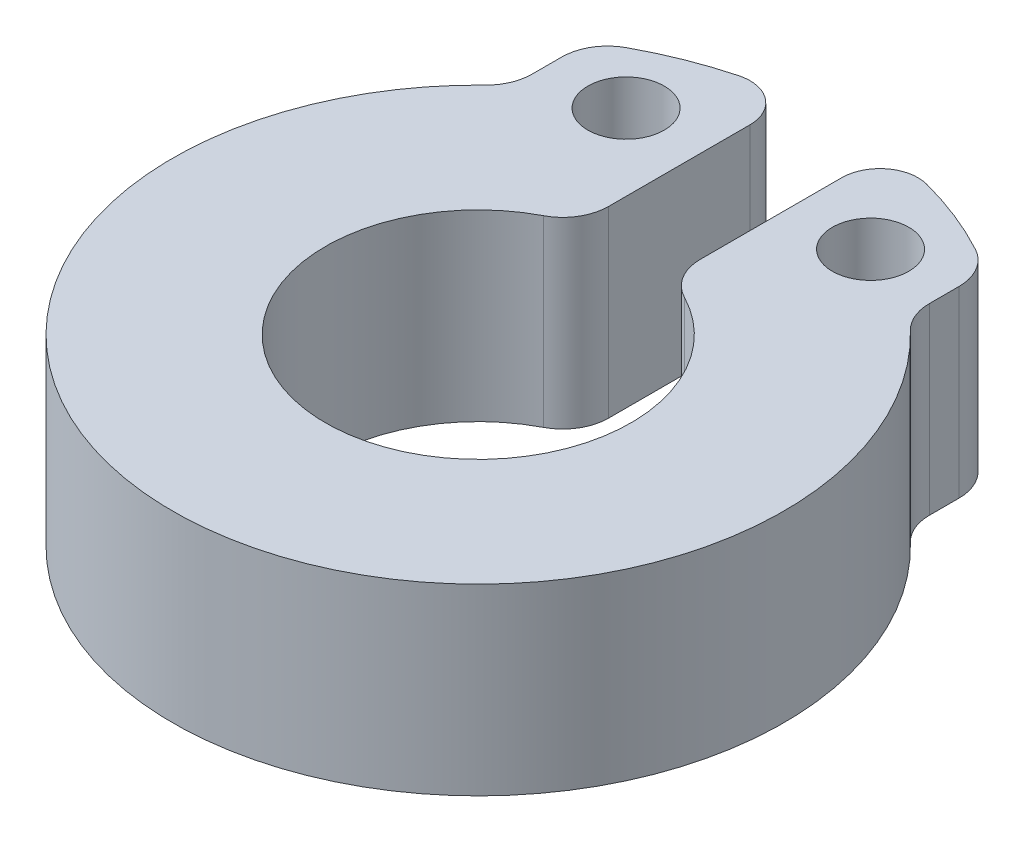
ISO-10303-21;
HEADER;
FILE_DESCRIPTION(('STEP AP214'),'2;1');
FILE_NAME('part.step','',(''),(''),'','','');
FILE_SCHEMA(('AUTOMOTIVE_DESIGN { 1 0 10303 214 1 1 1 1 }'));
ENDSEC;
DATA;
#1=APPLICATION_CONTEXT('core data for automotive mechanical design processes');
#2=APPLICATION_PROTOCOL_DEFINITION('international standard','automotive_design',2000,#1);
#3=PRODUCT_CONTEXT('',#1,'mechanical');
#4=PRODUCT('Part','Part','',(#3));
#5=PRODUCT_RELATED_PRODUCT_CATEGORY('part','',(#4));
#6=PRODUCT_DEFINITION_FORMATION('','',#4);
#7=PRODUCT_DEFINITION_CONTEXT('part definition',#1,'design');
#8=PRODUCT_DEFINITION('design','',#6,#7);
#9=PRODUCT_DEFINITION_SHAPE('','',#8);
#10=(LENGTH_UNIT() NAMED_UNIT(*) SI_UNIT(.MILLI.,.METRE.));
#11=(NAMED_UNIT(*) PLANE_ANGLE_UNIT() SI_UNIT($,.RADIAN.));
#12=(NAMED_UNIT(*) SI_UNIT($,.STERADIAN.) SOLID_ANGLE_UNIT());
#13=UNCERTAINTY_MEASURE_WITH_UNIT(LENGTH_MEASURE(1.E-05),#10,'distance_accuracy_value','');
#14=(GEOMETRIC_REPRESENTATION_CONTEXT(3) GLOBAL_UNCERTAINTY_ASSIGNED_CONTEXT((#13)) GLOBAL_UNIT_ASSIGNED_CONTEXT((#10,
#11,#12)) REPRESENTATION_CONTEXT('',''));
#15=CARTESIAN_POINT('',(0.,0.,0.));
#16=DIRECTION('',(0.,0.,1.));
#17=DIRECTION('',(1.,0.,0.));
#18=AXIS2_PLACEMENT_3D('',#15,#16,#17);
#19=CARTESIAN_POINT('',(0.,1.2,0.));
#20=DIRECTION('',(0.,1.,0.));
#21=DIRECTION('',(0.,0.,1.));
#22=AXIS2_PLACEMENT_3D('',#19,#20,#21);
#23=PLANE('',#22);
#24=CARTESIAN_POINT('',(-0.8,1.2,-1.7674241001832));
#25=DIRECTION('',(0.,1.,0.));
#26=DIRECTION('',(0.,0.,1.));
#27=AXIS2_PLACEMENT_3D('',#24,#25,#26);
#28=CIRCLE('',#27,0.25);
#29=CARTESIAN_POINT('',(-0.8,1.2,-1.5174241001832));
#30=VERTEX_POINT('',#29);
#31=EDGE_CURVE('E355',#30,#30,#28,.T.);
#32=ORIENTED_EDGE('',*,*,#31,.F.);
#33=EDGE_LOOP('',(#32));
#34=FACE_BOUND('',#33,.T.);
#35=CARTESIAN_POINT('',(0.,1.2,0.));
#36=DIRECTION('',(0.,1.,0.));
#37=DIRECTION('',(0.,0.,1.));
#38=AXIS2_PLACEMENT_3D('',#35,#36,#37);
#39=CIRCLE('',#38,2.4);
#40=CARTESIAN_POINT('',(1.14285714285714,1.2,-2.11042117858507));
#41=VERTEX_POINT('',#40);
#42=CARTESIAN_POINT('',(0.613953488372093,1.2,-2.32014247711552));
#43=VERTEX_POINT('',#42);
#44=EDGE_CURVE('E351',#41,#43,#39,.T.);
#45=ORIENTED_EDGE('',*,*,#44,.T.);
#46=CARTESIAN_POINT('',(0.55,1.2,-2.07846096908265));
#47=DIRECTION('',(0.,1.,0.));
#48=DIRECTION('',(0.,0.,1.));
#49=AXIS2_PLACEMENT_3D('',#46,#47,#48);
#50=CIRCLE('',#49,0.25);
#51=CARTESIAN_POINT('',(0.3,1.2,-2.07846096908265));
#52=VERTEX_POINT('',#51);
#53=EDGE_CURVE('E253',#43,#52,#50,.T.);
#54=ORIENTED_EDGE('',*,*,#53,.T.);
#55=DIRECTION('',(0.,0.,1.));
#56=VECTOR('',#55,1.);
#57=CARTESIAN_POINT('',(0.3,1.2,-0.953939201416946));
#58=LINE('',#57,#56);
#59=CARTESIAN_POINT('',(0.3,1.2,-1.15325625946708));
#60=VERTEX_POINT('',#59);
#61=EDGE_CURVE('E196',#52,#60,#58,.T.);
#62=ORIENTED_EDGE('',*,*,#61,.T.);
#63=CARTESIAN_POINT('',(0.6,1.2,-1.15325625946708));
#64=DIRECTION('',(0.,1.,0.));
#65=DIRECTION('',(0.,0.,1.));
#66=AXIS2_PLACEMENT_3D('',#63,#64,#65);
#67=CIRCLE('',#66,0.3);
#68=CARTESIAN_POINT('',(0.461538461538462,1.2,-0.887120199590061));
#69=VERTEX_POINT('',#68);
#70=EDGE_CURVE('E206',#60,#69,#67,.T.);
#71=ORIENTED_EDGE('',*,*,#70,.T.);
#72=CARTESIAN_POINT('',(0.,1.2,0.));
#73=DIRECTION('',(0.,-1.,0.));
#74=DIRECTION('',(0.,0.,1.));
#75=AXIS2_PLACEMENT_3D('',#72,#73,#74);
#76=CIRCLE('',#75,1.);
#77=CARTESIAN_POINT('',(-0.461538461538462,1.2,-0.887120199590061));
#78=VERTEX_POINT('',#77);
#79=EDGE_CURVE('E195',#69,#78,#76,.T.);
#80=ORIENTED_EDGE('',*,*,#79,.T.);
#81=CARTESIAN_POINT('',(-0.6,1.2,-1.15325625946708));
#82=DIRECTION('',(0.,1.,0.));
#83=DIRECTION('',(0.,0.,1.));
#84=AXIS2_PLACEMENT_3D('',#81,#82,#83);
#85=CIRCLE('',#84,0.3);
#86=CARTESIAN_POINT('',(-0.3,1.2,-1.15325625946708));
#87=VERTEX_POINT('',#86);
#88=EDGE_CURVE('E204',#78,#87,#85,.T.);
#89=ORIENTED_EDGE('',*,*,#88,.T.);
#90=DIRECTION('',(0.,0.,-1.));
#91=VECTOR('',#90,1.);
#92=CARTESIAN_POINT('',(-0.3,1.2,-0.953939201416946));
#93=LINE('',#92,#91);
#94=CARTESIAN_POINT('',(-0.3,1.2,-2.07846096908265));
#95=VERTEX_POINT('',#94);
#96=EDGE_CURVE('E337',#87,#95,#93,.T.);
#97=ORIENTED_EDGE('',*,*,#96,.T.);
#98=CARTESIAN_POINT('',(-0.55,1.2,-2.07846096908265));
#99=DIRECTION('',(0.,1.,0.));
#100=DIRECTION('',(0.,0.,1.));
#101=AXIS2_PLACEMENT_3D('',#98,#99,#100);
#102=CIRCLE('',#101,0.25);
#103=CARTESIAN_POINT('',(-0.613953488372093,1.2,-2.32014247711552));
#104=VERTEX_POINT('',#103);
#105=EDGE_CURVE('E56',#95,#104,#102,.T.);
#106=ORIENTED_EDGE('',*,*,#105,.T.);
#107=CARTESIAN_POINT('',(0.,1.2,0.));
#108=DIRECTION('',(0.,1.,0.));
#109=DIRECTION('',(0.,0.,1.));
#110=AXIS2_PLACEMENT_3D('',#107,#108,#109);
#111=CIRCLE('',#110,2.4);
#112=CARTESIAN_POINT('',(-1.14285714285714,1.2,-2.11042117858507));
#113=VERTEX_POINT('',#112);
#114=EDGE_CURVE('E258',#104,#113,#111,.T.);
#115=ORIENTED_EDGE('',*,*,#114,.T.);
#116=CARTESIAN_POINT('',(-1.,1.2,-1.84661853126194));
#117=DIRECTION('',(0.,1.,0.));
#118=DIRECTION('',(0.,0.,1.));
#119=AXIS2_PLACEMENT_3D('',#116,#117,#118);
#120=CIRCLE('',#119,0.3);
#121=CARTESIAN_POINT('',(-1.3,1.2,-1.84661853126194));
#122=VERTEX_POINT('',#121);
#123=EDGE_CURVE('E210',#113,#122,#120,.T.);
#124=ORIENTED_EDGE('',*,*,#123,.T.);
#125=DIRECTION('',(0.,0.,1.));
#126=VECTOR('',#125,1.);
#127=CARTESIAN_POINT('',(-1.3,1.2,-1.51986841535707));
#128=LINE('',#127,#126);
#129=CARTESIAN_POINT('',(-1.3,1.2,-1.65227116418583));
#130=VERTEX_POINT('',#129);
#131=EDGE_CURVE('E169',#122,#130,#128,.T.);
#132=ORIENTED_EDGE('',*,*,#131,.T.);
#133=CARTESIAN_POINT('',(-1.6,1.2,-1.65227116418583));
#134=DIRECTION('',(0.,1.,0.));
#135=DIRECTION('',(0.,0.,1.));
#136=AXIS2_PLACEMENT_3D('',#133,#134,#135);
#137=CIRCLE('',#136,0.3);
#138=CARTESIAN_POINT('',(-1.39130434782609,1.2,-1.43675753407464));
#139=VERTEX_POINT('',#138);
#140=EDGE_CURVE('E241',#130,#139,#137,.F.);
#141=ORIENTED_EDGE('',*,*,#140,.T.);
#142=CARTESIAN_POINT('',(0.,1.2,0.));
#143=DIRECTION('',(0.,1.,0.));
#144=DIRECTION('',(0.,0.,1.));
#145=AXIS2_PLACEMENT_3D('',#142,#143,#144);
#146=CIRCLE('',#145,2.);
#147=CARTESIAN_POINT('',(1.39130434782609,1.2,-1.43675753407464));
#148=VERTEX_POINT('',#147);
#149=EDGE_CURVE('E345',#139,#148,#146,.T.);
#150=ORIENTED_EDGE('',*,*,#149,.T.);
#151=CARTESIAN_POINT('',(1.6,1.2,-1.65227116418583));
#152=DIRECTION('',(0.,1.,0.));
#153=DIRECTION('',(0.,0.,1.));
#154=AXIS2_PLACEMENT_3D('',#151,#152,#153);
#155=CIRCLE('',#154,0.3);
#156=CARTESIAN_POINT('',(1.3,1.2,-1.65227116418583));
#157=VERTEX_POINT('',#156);
#158=EDGE_CURVE('E238',#148,#157,#155,.F.);
#159=ORIENTED_EDGE('',*,*,#158,.T.);
#160=DIRECTION('',(0.,0.,-1.));
#161=VECTOR('',#160,1.);
#162=CARTESIAN_POINT('',(1.3,1.2,-1.51986841535707));
#163=LINE('',#162,#161);
#164=CARTESIAN_POINT('',(1.3,1.2,-1.84661853126194));
#165=VERTEX_POINT('',#164);
#166=EDGE_CURVE('E348',#157,#165,#163,.T.);
#167=ORIENTED_EDGE('',*,*,#166,.T.);
#168=CARTESIAN_POINT('',(1.,1.2,-1.84661853126194));
#169=DIRECTION('',(0.,1.,0.));
#170=DIRECTION('',(0.,0.,1.));
#171=AXIS2_PLACEMENT_3D('',#168,#169,#170);
#172=CIRCLE('',#171,0.3);
#173=EDGE_CURVE('E208',#165,#41,#172,.T.);
#174=ORIENTED_EDGE('',*,*,#173,.T.);
#175=EDGE_LOOP('',(#45,#54,#62,#71,#80,#89,#97,#106,#115,#124,#132,#141,#150,#159,#167,#174));
#176=FACE_BOUND('',#175,.T.);
#177=CARTESIAN_POINT('',(0.8,1.2,-1.7674241001832));
#178=DIRECTION('',(0.,1.,0.));
#179=DIRECTION('',(0.,0.,1.));
#180=AXIS2_PLACEMENT_3D('',#177,#178,#179);
#181=CIRCLE('',#180,0.249999999999999);
#182=CARTESIAN_POINT('',(0.8,1.2,-1.5174241001832));
#183=VERTEX_POINT('',#182);
#184=EDGE_CURVE('E362',#183,#183,#181,.T.);
#185=ORIENTED_EDGE('',*,*,#184,.F.);
#186=EDGE_LOOP('',(#185));
#187=FACE_BOUND('',#186,.T.);
#188=ADVANCED_FACE('F36',(#34,#176,#187),#23,.T.);
#189=CARTESIAN_POINT('',(0.,0.,0.));
#190=DIRECTION('',(0.,1.,0.));
#191=DIRECTION('',(0.,0.,1.));
#192=AXIS2_PLACEMENT_3D('',#189,#190,#191);
#193=PLANE('',#192);
#194=DIRECTION('',(0.,0.,1.));
#195=VECTOR('',#194,1.);
#196=CARTESIAN_POINT('',(0.3,0.,-0.953939201416946));
#197=LINE('',#196,#195);
#198=CARTESIAN_POINT('',(0.3,0.,-2.07846096908265));
#199=VERTEX_POINT('',#198);
#200=CARTESIAN_POINT('',(0.3,0.,-1.15325625946708));
#201=VERTEX_POINT('',#200);
#202=EDGE_CURVE('E193',#199,#201,#197,.T.);
#203=ORIENTED_EDGE('',*,*,#202,.F.);
#204=CARTESIAN_POINT('',(0.55,0.,-2.07846096908265));
#205=DIRECTION('',(0.,1.,0.));
#206=DIRECTION('',(0.,0.,1.));
#207=AXIS2_PLACEMENT_3D('',#204,#205,#206);
#208=CIRCLE('',#207,0.25);
#209=CARTESIAN_POINT('',(0.613953488372093,0.,-2.32014247711552));
#210=VERTEX_POINT('',#209);
#211=EDGE_CURVE('E248',#199,#210,#208,.F.);
#212=ORIENTED_EDGE('',*,*,#211,.T.);
#213=CARTESIAN_POINT('',(0.,0.,0.));
#214=DIRECTION('',(0.,1.,0.));
#215=DIRECTION('',(0.,0.,1.));
#216=AXIS2_PLACEMENT_3D('',#213,#214,#215);
#217=CIRCLE('',#216,2.4);
#218=CARTESIAN_POINT('',(1.14285714285714,0.,-2.11042117858507));
#219=VERTEX_POINT('',#218);
#220=EDGE_CURVE('E190',#219,#210,#217,.T.);
#221=ORIENTED_EDGE('',*,*,#220,.F.);
#222=CARTESIAN_POINT('',(1.,0.,-1.84661853126194));
#223=DIRECTION('',(0.,1.,0.));
#224=DIRECTION('',(0.,0.,1.));
#225=AXIS2_PLACEMENT_3D('',#222,#223,#224);
#226=CIRCLE('',#225,0.3);
#227=CARTESIAN_POINT('',(1.3,0.,-1.84661853126194));
#228=VERTEX_POINT('',#227);
#229=EDGE_CURVE('E160',#219,#228,#226,.F.);
#230=ORIENTED_EDGE('',*,*,#229,.T.);
#231=DIRECTION('',(0.,0.,-1.));
#232=VECTOR('',#231,1.);
#233=CARTESIAN_POINT('',(1.3,0.,-1.51986841535707));
#234=LINE('',#233,#232);
#235=CARTESIAN_POINT('',(1.3,0.,-1.65227116418583));
#236=VERTEX_POINT('',#235);
#237=EDGE_CURVE('E182',#236,#228,#234,.T.);
#238=ORIENTED_EDGE('',*,*,#237,.F.);
#239=CARTESIAN_POINT('',(1.6,0.,-1.65227116418583));
#240=DIRECTION('',(0.,1.,0.));
#241=DIRECTION('',(0.,0.,1.));
#242=AXIS2_PLACEMENT_3D('',#239,#240,#241);
#243=CIRCLE('',#242,0.3);
#244=CARTESIAN_POINT('',(1.39130434782609,0.,-1.43675753407464));
#245=VERTEX_POINT('',#244);
#246=EDGE_CURVE('E236',#236,#245,#243,.T.);
#247=ORIENTED_EDGE('',*,*,#246,.T.);
#248=CARTESIAN_POINT('',(0.,0.,0.));
#249=DIRECTION('',(0.,1.,0.));
#250=DIRECTION('',(0.,0.,1.));
#251=AXIS2_PLACEMENT_3D('',#248,#249,#250);
#252=CIRCLE('',#251,2.);
#253=CARTESIAN_POINT('',(-1.39130434782609,0.,-1.43675753407464));
#254=VERTEX_POINT('',#253);
#255=EDGE_CURVE('E178',#254,#245,#252,.T.);
#256=ORIENTED_EDGE('',*,*,#255,.F.);
#257=CARTESIAN_POINT('',(-1.6,0.,-1.65227116418583));
#258=DIRECTION('',(0.,1.,0.));
#259=DIRECTION('',(0.,0.,1.));
#260=AXIS2_PLACEMENT_3D('',#257,#258,#259);
#261=CIRCLE('',#260,0.3);
#262=CARTESIAN_POINT('',(-1.3,0.,-1.65227116418583));
#263=VERTEX_POINT('',#262);
#264=EDGE_CURVE('E177',#254,#263,#261,.T.);
#265=ORIENTED_EDGE('',*,*,#264,.T.);
#266=DIRECTION('',(0.,0.,1.));
#267=VECTOR('',#266,1.);
#268=CARTESIAN_POINT('',(-1.3,0.,-1.51986841535707));
#269=LINE('',#268,#267);
#270=CARTESIAN_POINT('',(-1.3,0.,-1.84661853126194));
#271=VERTEX_POINT('',#270);
#272=EDGE_CURVE('E166',#271,#263,#269,.T.);
#273=ORIENTED_EDGE('',*,*,#272,.F.);
#274=CARTESIAN_POINT('',(-1.,0.,-1.84661853126194));
#275=DIRECTION('',(0.,1.,0.));
#276=DIRECTION('',(0.,0.,1.));
#277=AXIS2_PLACEMENT_3D('',#274,#275,#276);
#278=CIRCLE('',#277,0.3);
#279=CARTESIAN_POINT('',(-1.14285714285714,0.,-2.11042117858507));
#280=VERTEX_POINT('',#279);
#281=EDGE_CURVE('E150',#271,#280,#278,.F.);
#282=ORIENTED_EDGE('',*,*,#281,.T.);
#283=CARTESIAN_POINT('',(0.,0.,0.));
#284=DIRECTION('',(0.,1.,0.));
#285=DIRECTION('',(0.,0.,1.));
#286=AXIS2_PLACEMENT_3D('',#283,#284,#285);
#287=CIRCLE('',#286,2.4);
#288=CARTESIAN_POINT('',(-0.613953488372093,0.,-2.32014247711552));
#289=VERTEX_POINT('',#288);
#290=EDGE_CURVE('E179',#289,#280,#287,.T.);
#291=ORIENTED_EDGE('',*,*,#290,.F.);
#292=CARTESIAN_POINT('',(-0.55,0.,-2.07846096908265));
#293=DIRECTION('',(0.,1.,0.));
#294=DIRECTION('',(0.,0.,1.));
#295=AXIS2_PLACEMENT_3D('',#292,#293,#294);
#296=CIRCLE('',#295,0.25);
#297=CARTESIAN_POINT('',(-0.3,0.,-2.07846096908265));
#298=VERTEX_POINT('',#297);
#299=EDGE_CURVE('E246',#289,#298,#296,.F.);
#300=ORIENTED_EDGE('',*,*,#299,.T.);
#301=DIRECTION('',(0.,0.,-1.));
#302=VECTOR('',#301,1.);
#303=CARTESIAN_POINT('',(-0.3,0.,-0.953939201416946));
#304=LINE('',#303,#302);
#305=CARTESIAN_POINT('',(-0.3,0.,-1.15325625946708));
#306=VERTEX_POINT('',#305);
#307=EDGE_CURVE('E184',#306,#298,#304,.T.);
#308=ORIENTED_EDGE('',*,*,#307,.F.);
#309=CARTESIAN_POINT('',(-0.6,0.,-1.15325625946708));
#310=DIRECTION('',(0.,1.,0.));
#311=DIRECTION('',(0.,0.,1.));
#312=AXIS2_PLACEMENT_3D('',#309,#310,#311);
#313=CIRCLE('',#312,0.3);
#314=CARTESIAN_POINT('',(-0.461538461538462,0.,-0.887120199590061));
#315=VERTEX_POINT('',#314);
#316=EDGE_CURVE('E170',#306,#315,#313,.F.);
#317=ORIENTED_EDGE('',*,*,#316,.T.);
#318=CARTESIAN_POINT('',(0.,0.,0.));
#319=DIRECTION('',(0.,-1.,0.));
#320=DIRECTION('',(0.,0.,1.));
#321=AXIS2_PLACEMENT_3D('',#318,#319,#320);
#322=CIRCLE('',#321,1.);
#323=CARTESIAN_POINT('',(0.461538461538462,0.,-0.887120199590061));
#324=VERTEX_POINT('',#323);
#325=EDGE_CURVE('E263',#324,#315,#322,.T.);
#326=ORIENTED_EDGE('',*,*,#325,.F.);
#327=CARTESIAN_POINT('',(0.6,0.,-1.15325625946708));
#328=DIRECTION('',(0.,1.,0.));
#329=DIRECTION('',(0.,0.,1.));
#330=AXIS2_PLACEMENT_3D('',#327,#328,#329);
#331=CIRCLE('',#330,0.3);
#332=EDGE_CURVE('E199',#324,#201,#331,.F.);
#333=ORIENTED_EDGE('',*,*,#332,.T.);
#334=EDGE_LOOP('',(#203,#212,#221,#230,#238,#247,#256,#265,#273,#282,#291,#300,#308,#317,#326,#333));
#335=FACE_BOUND('',#334,.T.);
#336=CARTESIAN_POINT('',(-0.8,0.,-1.7674241001832));
#337=DIRECTION('',(0.,1.,0.));
#338=DIRECTION('',(0.,0.,1.));
#339=AXIS2_PLACEMENT_3D('',#336,#337,#338);
#340=CIRCLE('',#339,0.25);
#341=CARTESIAN_POINT('',(-0.8,0.,-1.5174241001832));
#342=VERTEX_POINT('',#341);
#343=EDGE_CURVE('E358',#342,#342,#340,.T.);
#344=ORIENTED_EDGE('',*,*,#343,.T.);
#345=EDGE_LOOP('',(#344));
#346=FACE_BOUND('',#345,.T.);
#347=CARTESIAN_POINT('',(0.8,0.,-1.7674241001832));
#348=DIRECTION('',(0.,1.,0.));
#349=DIRECTION('',(0.,0.,1.));
#350=AXIS2_PLACEMENT_3D('',#347,#348,#349);
#351=CIRCLE('',#350,0.249999999999999);
#352=CARTESIAN_POINT('',(0.8,0.,-1.5174241001832));
#353=VERTEX_POINT('',#352);
#354=EDGE_CURVE('E364',#353,#353,#351,.T.);
#355=ORIENTED_EDGE('',*,*,#354,.T.);
#356=EDGE_LOOP('',(#355));
#357=FACE_BOUND('',#356,.T.);
#358=ADVANCED_FACE('F174',(#335,#346,#357),#193,.F.);
#359=CARTESIAN_POINT('',(0.,1.2,0.));
#360=DIRECTION('',(0.,-1.,0.));
#361=DIRECTION('',(0.,0.,-1.));
#362=AXIS2_PLACEMENT_3D('',#359,#360,#361);
#363=CYLINDRICAL_SURFACE('',#362,1.);
#364=ORIENTED_EDGE('',*,*,#79,.F.);
#365=DIRECTION('',(0.,-1.,0.));
#366=VECTOR('',#365,1.);
#367=CARTESIAN_POINT('',(0.461538461538462,1.2,-0.887120199590061));
#368=LINE('',#367,#366);
#369=EDGE_CURVE('E227',#69,#324,#368,.T.);
#370=ORIENTED_EDGE('',*,*,#369,.T.);
#371=ORIENTED_EDGE('',*,*,#325,.T.);
#372=DIRECTION('',(0.,-1.,0.));
#373=VECTOR('',#372,1.);
#374=CARTESIAN_POINT('',(-0.461538461538462,1.2,-0.887120199590061));
#375=LINE('',#374,#373);
#376=EDGE_CURVE('E225',#315,#78,#375,.F.);
#377=ORIENTED_EDGE('',*,*,#376,.T.);
#378=EDGE_LOOP('',(#364,#370,#371,#377));
#379=FACE_BOUND('',#378,.T.);
#380=ADVANCED_FACE('F277',(#379),#363,.F.);
#381=CARTESIAN_POINT('',(-0.3,1.2,-0.953939201416946));
#382=DIRECTION('',(-1.,0.,0.));
#383=DIRECTION('',(0.,0.,1.));
#384=AXIS2_PLACEMENT_3D('',#381,#382,#383);
#385=PLANE('',#384);
#386=ORIENTED_EDGE('',*,*,#307,.T.);
#387=DIRECTION('',(0.,-1.,0.));
#388=VECTOR('',#387,1.);
#389=CARTESIAN_POINT('',(-0.3,1.2,-2.07846096908265));
#390=LINE('',#389,#388);
#391=EDGE_CURVE('E11',#298,#95,#390,.F.);
#392=ORIENTED_EDGE('',*,*,#391,.T.);
#393=ORIENTED_EDGE('',*,*,#96,.F.);
#394=DIRECTION('',(0.,-1.,0.));
#395=VECTOR('',#394,1.);
#396=CARTESIAN_POINT('',(-0.3,1.2,-1.15325625946708));
#397=LINE('',#396,#395);
#398=EDGE_CURVE('E233',#87,#306,#397,.T.);
#399=ORIENTED_EDGE('',*,*,#398,.T.);
#400=EDGE_LOOP('',(#386,#392,#393,#399));
#401=FACE_BOUND('',#400,.T.);
#402=ADVANCED_FACE('F261',(#401),#385,.F.);
#403=CARTESIAN_POINT('',(0.,1.2,0.));
#404=DIRECTION('',(0.,-1.,0.));
#405=DIRECTION('',(0.,0.,-1.));
#406=AXIS2_PLACEMENT_3D('',#403,#404,#405);
#407=CYLINDRICAL_SURFACE('',#406,2.4);
#408=ORIENTED_EDGE('',*,*,#114,.F.);
#409=DIRECTION('',(0.,-1.,0.));
#410=VECTOR('',#409,1.);
#411=CARTESIAN_POINT('',(-0.613953488372093,1.2,-2.32014247711552));
#412=LINE('',#411,#410);
#413=EDGE_CURVE('E44',#104,#289,#412,.T.);
#414=ORIENTED_EDGE('',*,*,#413,.T.);
#415=ORIENTED_EDGE('',*,*,#290,.T.);
#416=DIRECTION('',(0.,-1.,0.));
#417=VECTOR('',#416,1.);
#418=CARTESIAN_POINT('',(-1.14285714285714,1.2,-2.11042117858507));
#419=LINE('',#418,#417);
#420=EDGE_CURVE('E156',#280,#113,#419,.F.);
#421=ORIENTED_EDGE('',*,*,#420,.T.);
#422=EDGE_LOOP('',(#408,#414,#415,#421));
#423=FACE_BOUND('',#422,.T.);
#424=ADVANCED_FACE('F257',(#423),#407,.T.);
#425=CARTESIAN_POINT('',(-1.3,1.2,-1.51986841535707));
#426=DIRECTION('',(1.,0.,0.));
#427=DIRECTION('',(0.,0.,-1.));
#428=AXIS2_PLACEMENT_3D('',#425,#426,#427);
#429=PLANE('',#428);
#430=ORIENTED_EDGE('',*,*,#131,.F.);
#431=DIRECTION('',(0.,-1.,0.));
#432=VECTOR('',#431,1.);
#433=CARTESIAN_POINT('',(-1.3,1.2,-1.84661853126194));
#434=LINE('',#433,#432);
#435=EDGE_CURVE('E154',#122,#271,#434,.T.);
#436=ORIENTED_EDGE('',*,*,#435,.T.);
#437=ORIENTED_EDGE('',*,*,#272,.T.);
#438=DIRECTION('',(0.,1.,0.));
#439=VECTOR('',#438,1.);
#440=CARTESIAN_POINT('',(-1.3,1.2,-1.65227116418583));
#441=LINE('',#440,#439);
#442=EDGE_CURVE('E171',#263,#130,#441,.T.);
#443=ORIENTED_EDGE('',*,*,#442,.T.);
#444=EDGE_LOOP('',(#430,#436,#437,#443));
#445=FACE_BOUND('',#444,.T.);
#446=ADVANCED_FACE('F165',(#445),#429,.F.);
#447=CARTESIAN_POINT('',(0.,1.2,0.));
#448=DIRECTION('',(0.,-1.,0.));
#449=DIRECTION('',(0.,0.,-1.));
#450=AXIS2_PLACEMENT_3D('',#447,#448,#449);
#451=CYLINDRICAL_SURFACE('',#450,2.);
#452=ORIENTED_EDGE('',*,*,#255,.T.);
#453=DIRECTION('',(0.,-1.,0.));
#454=VECTOR('',#453,1.);
#455=CARTESIAN_POINT('',(1.39130434782609,1.2,-1.43675753407464));
#456=LINE('',#455,#454);
#457=EDGE_CURVE('E223',#245,#148,#456,.F.);
#458=ORIENTED_EDGE('',*,*,#457,.T.);
#459=ORIENTED_EDGE('',*,*,#149,.F.);
#460=DIRECTION('',(0.,-1.,0.));
#461=VECTOR('',#460,1.);
#462=CARTESIAN_POINT('',(-1.39130434782609,1.2,-1.43675753407464));
#463=LINE('',#462,#461);
#464=EDGE_CURVE('E220',#139,#254,#463,.T.);
#465=ORIENTED_EDGE('',*,*,#464,.T.);
#466=EDGE_LOOP('',(#452,#458,#459,#465));
#467=FACE_BOUND('',#466,.T.);
#468=ADVANCED_FACE('F295',(#467),#451,.T.);
#469=CARTESIAN_POINT('',(1.3,1.2,-1.51986841535707));
#470=DIRECTION('',(-1.,0.,0.));
#471=DIRECTION('',(0.,0.,1.));
#472=AXIS2_PLACEMENT_3D('',#469,#470,#471);
#473=PLANE('',#472);
#474=ORIENTED_EDGE('',*,*,#237,.T.);
#475=DIRECTION('',(0.,-1.,0.));
#476=VECTOR('',#475,1.);
#477=CARTESIAN_POINT('',(1.3,1.2,-1.84661853126194));
#478=LINE('',#477,#476);
#479=EDGE_CURVE('E218',#228,#165,#478,.F.);
#480=ORIENTED_EDGE('',*,*,#479,.T.);
#481=ORIENTED_EDGE('',*,*,#166,.F.);
#482=DIRECTION('',(0.,1.,0.));
#483=VECTOR('',#482,1.);
#484=CARTESIAN_POINT('',(1.3,0.,-1.65227116418583));
#485=LINE('',#484,#483);
#486=EDGE_CURVE('E215',#157,#236,#485,.F.);
#487=ORIENTED_EDGE('',*,*,#486,.T.);
#488=EDGE_LOOP('',(#474,#480,#481,#487));
#489=FACE_BOUND('',#488,.T.);
#490=ADVANCED_FACE('F291',(#489),#473,.F.);
#491=CARTESIAN_POINT('',(0.,1.2,0.));
#492=DIRECTION('',(0.,-1.,0.));
#493=DIRECTION('',(0.,0.,-1.));
#494=AXIS2_PLACEMENT_3D('',#491,#492,#493);
#495=CYLINDRICAL_SURFACE('',#494,2.4);
#496=ORIENTED_EDGE('',*,*,#220,.T.);
#497=DIRECTION('',(0.,-1.,0.));
#498=VECTOR('',#497,1.);
#499=CARTESIAN_POINT('',(0.613953488372093,1.2,-2.32014247711552));
#500=LINE('',#499,#498);
#501=EDGE_CURVE('E250',#210,#43,#500,.F.);
#502=ORIENTED_EDGE('',*,*,#501,.T.);
#503=ORIENTED_EDGE('',*,*,#44,.F.);
#504=DIRECTION('',(0.,-1.,0.));
#505=VECTOR('',#504,1.);
#506=CARTESIAN_POINT('',(1.14285714285714,1.2,-2.11042117858507));
#507=LINE('',#506,#505);
#508=EDGE_CURVE('E212',#41,#219,#507,.T.);
#509=ORIENTED_EDGE('',*,*,#508,.T.);
#510=EDGE_LOOP('',(#496,#502,#503,#509));
#511=FACE_BOUND('',#510,.T.);
#512=ADVANCED_FACE('F287',(#511),#495,.T.);
#513=CARTESIAN_POINT('',(0.3,1.2,-0.953939201416946));
#514=DIRECTION('',(1.,0.,0.));
#515=DIRECTION('',(0.,0.,-1.));
#516=AXIS2_PLACEMENT_3D('',#513,#514,#515);
#517=PLANE('',#516);
#518=ORIENTED_EDGE('',*,*,#61,.F.);
#519=DIRECTION('',(0.,-1.,0.));
#520=VECTOR('',#519,1.);
#521=CARTESIAN_POINT('',(0.3,1.2,-2.07846096908265));
#522=LINE('',#521,#520);
#523=EDGE_CURVE('E243',#52,#199,#522,.T.);
#524=ORIENTED_EDGE('',*,*,#523,.T.);
#525=ORIENTED_EDGE('',*,*,#202,.T.);
#526=DIRECTION('',(0.,-1.,0.));
#527=VECTOR('',#526,1.);
#528=CARTESIAN_POINT('',(0.3,1.2,-1.15325625946708));
#529=LINE('',#528,#527);
#530=EDGE_CURVE('E230',#201,#60,#529,.F.);
#531=ORIENTED_EDGE('',*,*,#530,.T.);
#532=EDGE_LOOP('',(#518,#524,#525,#531));
#533=FACE_BOUND('',#532,.T.);
#534=ADVANCED_FACE('F284',(#533),#517,.F.);
#535=CARTESIAN_POINT('',(-0.8,1.2,-1.7674241001832));
#536=DIRECTION('',(0.,-1.,0.));
#537=DIRECTION('',(0.,0.,-1.));
#538=AXIS2_PLACEMENT_3D('',#535,#536,#537);
#539=CYLINDRICAL_SURFACE('',#538,0.25);
#540=ORIENTED_EDGE('',*,*,#31,.T.);
#541=EDGE_LOOP('',(#540));
#542=FACE_BOUND('',#541,.T.);
#543=ORIENTED_EDGE('',*,*,#343,.F.);
#544=EDGE_LOOP('',(#543));
#545=FACE_BOUND('',#544,.T.);
#546=ADVANCED_FACE('F281',(#542,#545),#539,.F.);
#547=CARTESIAN_POINT('',(0.8,1.2,-1.7674241001832));
#548=DIRECTION('',(0.,-1.,0.));
#549=DIRECTION('',(0.,0.,-1.));
#550=AXIS2_PLACEMENT_3D('',#547,#548,#549);
#551=CYLINDRICAL_SURFACE('',#550,0.249999999999999);
#552=ORIENTED_EDGE('',*,*,#184,.T.);
#553=EDGE_LOOP('',(#552));
#554=FACE_BOUND('',#553,.T.);
#555=ORIENTED_EDGE('',*,*,#354,.F.);
#556=EDGE_LOOP('',(#555));
#557=FACE_BOUND('',#556,.T.);
#558=ADVANCED_FACE('F312',(#554,#557),#551,.F.);
#559=CARTESIAN_POINT('',(-1.,1.2,-1.84661853126194));
#560=DIRECTION('',(0.,-1.,0.));
#561=DIRECTION('',(0.,0.,-1.));
#562=AXIS2_PLACEMENT_3D('',#559,#560,#561);
#563=CYLINDRICAL_SURFACE('',#562,0.3);
#564=ORIENTED_EDGE('',*,*,#123,.F.);
#565=ORIENTED_EDGE('',*,*,#420,.F.);
#566=ORIENTED_EDGE('',*,*,#281,.F.);
#567=ORIENTED_EDGE('',*,*,#435,.F.);
#568=EDGE_LOOP('',(#564,#565,#566,#567));
#569=FACE_BOUND('',#568,.T.);
#570=ADVANCED_FACE('F153',(#569),#563,.T.);
#571=CARTESIAN_POINT('',(1.,1.2,-1.84661853126194));
#572=DIRECTION('',(0.,-1.,0.));
#573=DIRECTION('',(0.,0.,-1.));
#574=AXIS2_PLACEMENT_3D('',#571,#572,#573);
#575=CYLINDRICAL_SURFACE('',#574,0.3);
#576=ORIENTED_EDGE('',*,*,#173,.F.);
#577=ORIENTED_EDGE('',*,*,#479,.F.);
#578=ORIENTED_EDGE('',*,*,#229,.F.);
#579=ORIENTED_EDGE('',*,*,#508,.F.);
#580=EDGE_LOOP('',(#576,#577,#578,#579));
#581=FACE_BOUND('',#580,.T.);
#582=ADVANCED_FACE('F311',(#581),#575,.T.);
#583=CARTESIAN_POINT('',(1.6,1.2,-1.65227116418583));
#584=DIRECTION('',(0.,-1.,0.));
#585=DIRECTION('',(0.,0.,-1.));
#586=AXIS2_PLACEMENT_3D('',#583,#584,#585);
#587=CYLINDRICAL_SURFACE('',#586,0.3);
#588=ORIENTED_EDGE('',*,*,#158,.F.);
#589=ORIENTED_EDGE('',*,*,#457,.F.);
#590=ORIENTED_EDGE('',*,*,#246,.F.);
#591=ORIENTED_EDGE('',*,*,#486,.F.);
#592=EDGE_LOOP('',(#588,#589,#590,#591));
#593=FACE_BOUND('',#592,.T.);
#594=ADVANCED_FACE('F315',(#593),#587,.F.);
#595=CARTESIAN_POINT('',(-1.6,1.2,-1.65227116418583));
#596=DIRECTION('',(0.,-1.,0.));
#597=DIRECTION('',(0.,0.,-1.));
#598=AXIS2_PLACEMENT_3D('',#595,#596,#597);
#599=CYLINDRICAL_SURFACE('',#598,0.3);
#600=ORIENTED_EDGE('',*,*,#140,.F.);
#601=ORIENTED_EDGE('',*,*,#442,.F.);
#602=ORIENTED_EDGE('',*,*,#264,.F.);
#603=ORIENTED_EDGE('',*,*,#464,.F.);
#604=EDGE_LOOP('',(#600,#601,#602,#603));
#605=FACE_BOUND('',#604,.T.);
#606=ADVANCED_FACE('F319',(#605),#599,.F.);
#607=CARTESIAN_POINT('',(0.6,1.2,-1.15325625946708));
#608=DIRECTION('',(0.,-1.,0.));
#609=DIRECTION('',(0.,0.,-1.));
#610=AXIS2_PLACEMENT_3D('',#607,#608,#609);
#611=CYLINDRICAL_SURFACE('',#610,0.3);
#612=ORIENTED_EDGE('',*,*,#70,.F.);
#613=ORIENTED_EDGE('',*,*,#530,.F.);
#614=ORIENTED_EDGE('',*,*,#332,.F.);
#615=ORIENTED_EDGE('',*,*,#369,.F.);
#616=EDGE_LOOP('',(#612,#613,#614,#615));
#617=FACE_BOUND('',#616,.T.);
#618=ADVANCED_FACE('F323',(#617),#611,.T.);
#619=CARTESIAN_POINT('',(-0.6,1.2,-1.15325625946708));
#620=DIRECTION('',(0.,-1.,0.));
#621=DIRECTION('',(0.,0.,-1.));
#622=AXIS2_PLACEMENT_3D('',#619,#620,#621);
#623=CYLINDRICAL_SURFACE('',#622,0.3);
#624=ORIENTED_EDGE('',*,*,#88,.F.);
#625=ORIENTED_EDGE('',*,*,#376,.F.);
#626=ORIENTED_EDGE('',*,*,#316,.F.);
#627=ORIENTED_EDGE('',*,*,#398,.F.);
#628=EDGE_LOOP('',(#624,#625,#626,#627));
#629=FACE_BOUND('',#628,.T.);
#630=ADVANCED_FACE('F269',(#629),#623,.T.);
#631=CARTESIAN_POINT('',(0.55,1.2,-2.07846096908265));
#632=DIRECTION('',(0.,-1.,0.));
#633=DIRECTION('',(0.,0.,-1.));
#634=AXIS2_PLACEMENT_3D('',#631,#632,#633);
#635=CYLINDRICAL_SURFACE('',#634,0.25);
#636=ORIENTED_EDGE('',*,*,#53,.F.);
#637=ORIENTED_EDGE('',*,*,#501,.F.);
#638=ORIENTED_EDGE('',*,*,#211,.F.);
#639=ORIENTED_EDGE('',*,*,#523,.F.);
#640=EDGE_LOOP('',(#636,#637,#638,#639));
#641=FACE_BOUND('',#640,.T.);
#642=ADVANCED_FACE('F265',(#641),#635,.T.);
#643=CARTESIAN_POINT('',(-0.55,1.2,-2.07846096908265));
#644=DIRECTION('',(0.,-1.,0.));
#645=DIRECTION('',(0.,0.,-1.));
#646=AXIS2_PLACEMENT_3D('',#643,#644,#645);
#647=CYLINDRICAL_SURFACE('',#646,0.25);
#648=ORIENTED_EDGE('',*,*,#105,.F.);
#649=ORIENTED_EDGE('',*,*,#391,.F.);
#650=ORIENTED_EDGE('',*,*,#299,.F.);
#651=ORIENTED_EDGE('',*,*,#413,.F.);
#652=EDGE_LOOP('',(#648,#649,#650,#651));
#653=FACE_BOUND('',#652,.T.);
#654=ADVANCED_FACE('F38',(#653),#647,.T.);
#655=CLOSED_SHELL('',(#188,#358,#380,#402,#424,#446,#468,#490,#512,#534,#546,#558,#570,#582,
#594,#606,#618,#630,#642,#654));
#656=MANIFOLD_SOLID_BREP('B2',#655);
#657=ADVANCED_BREP_SHAPE_REPRESENTATION('',(#18,#656),#14);
#658=SHAPE_DEFINITION_REPRESENTATION(#9,#657);
ENDSEC;
END-ISO-10303-21;
